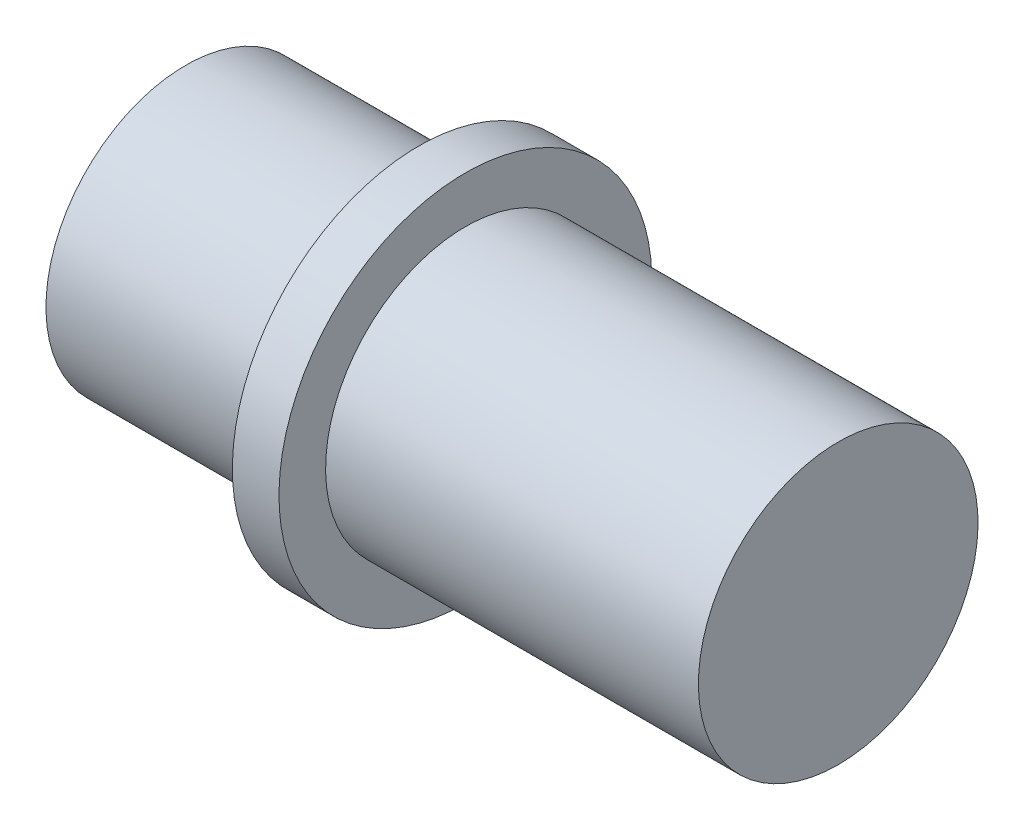
ISO-10303-21;
HEADER;
FILE_DESCRIPTION(('STEP AP214'),'2;1');
FILE_NAME('part.step','',(''),(''),'','','');
FILE_SCHEMA(('AUTOMOTIVE_DESIGN { 1 0 10303 214 1 1 1 1 }'));
ENDSEC;
DATA;
#1=APPLICATION_CONTEXT('core data for automotive mechanical design processes');
#2=APPLICATION_PROTOCOL_DEFINITION('international standard','automotive_design',2000,#1);
#3=PRODUCT_CONTEXT('',#1,'mechanical');
#4=PRODUCT('Part','Part','',(#3));
#5=PRODUCT_RELATED_PRODUCT_CATEGORY('part','',(#4));
#6=PRODUCT_DEFINITION_FORMATION('','',#4);
#7=PRODUCT_DEFINITION_CONTEXT('part definition',#1,'design');
#8=PRODUCT_DEFINITION('design','',#6,#7);
#9=PRODUCT_DEFINITION_SHAPE('','',#8);
#10=(LENGTH_UNIT() NAMED_UNIT(*) SI_UNIT(.MILLI.,.METRE.));
#11=(NAMED_UNIT(*) PLANE_ANGLE_UNIT() SI_UNIT($,.RADIAN.));
#12=(NAMED_UNIT(*) SI_UNIT($,.STERADIAN.) SOLID_ANGLE_UNIT());
#13=UNCERTAINTY_MEASURE_WITH_UNIT(LENGTH_MEASURE(1.E-05),#10,'distance_accuracy_value','');
#14=(GEOMETRIC_REPRESENTATION_CONTEXT(3) GLOBAL_UNCERTAINTY_ASSIGNED_CONTEXT((#13)) GLOBAL_UNIT_ASSIGNED_CONTEXT((#10,
#11,#12)) REPRESENTATION_CONTEXT('',''));
#15=CARTESIAN_POINT('',(0.,0.,0.));
#16=DIRECTION('',(0.,0.,1.));
#17=DIRECTION('',(1.,0.,0.));
#18=AXIS2_PLACEMENT_3D('',#15,#16,#17);
#19=CARTESIAN_POINT('',(0.,0.,0.));
#20=DIRECTION('',(1.,0.,0.));
#21=DIRECTION('',(0.,1.,0.));
#22=AXIS2_PLACEMENT_3D('',#19,#20,#21);
#23=PLANE('',#22);
#24=CARTESIAN_POINT('',(0.,0.,0.));
#25=DIRECTION('',(-1.,0.,0.));
#26=DIRECTION('',(0.,-1.,0.));
#27=AXIS2_PLACEMENT_3D('',#24,#25,#26);
#28=CIRCLE('',#27,3.);
#29=CARTESIAN_POINT('',(0.,-3.,0.));
#30=VERTEX_POINT('',#29);
#31=EDGE_CURVE('E11',#30,#30,#28,.T.);
#32=ORIENTED_EDGE('',*,*,#31,.T.);
#33=EDGE_LOOP('',(#32));
#34=FACE_BOUND('',#33,.T.);
#35=DIRECTION('',(0.,-0.5,-0.866025403784439));
#36=VECTOR('',#35,1.);
#37=CARTESIAN_POINT('',(0.,1.73205080756888,0.));
#38=LINE('',#37,#36);
#39=CARTESIAN_POINT('',(0.,1.73205080756888,0.));
#40=VERTEX_POINT('',#39);
#41=CARTESIAN_POINT('',(0.,0.866025403784439,-1.5));
#42=VERTEX_POINT('',#41);
#43=EDGE_CURVE('E147',#40,#42,#38,.T.);
#44=ORIENTED_EDGE('',*,*,#43,.F.);
#45=DIRECTION('',(0.,0.5,-0.866025403784439));
#46=VECTOR('',#45,1.);
#47=CARTESIAN_POINT('',(0.,0.86602540378444,1.5));
#48=LINE('',#47,#46);
#49=CARTESIAN_POINT('',(0.,0.86602540378444,1.5));
#50=VERTEX_POINT('',#49);
#51=EDGE_CURVE('E48',#50,#40,#48,.T.);
#52=ORIENTED_EDGE('',*,*,#51,.F.);
#53=DIRECTION('',(0.,1.,0.));
#54=VECTOR('',#53,1.);
#55=CARTESIAN_POINT('',(0.,-0.866025403784439,1.5));
#56=LINE('',#55,#54);
#57=CARTESIAN_POINT('',(0.,-0.866025403784439,1.5));
#58=VERTEX_POINT('',#57);
#59=EDGE_CURVE('E118',#58,#50,#56,.T.);
#60=ORIENTED_EDGE('',*,*,#59,.F.);
#61=DIRECTION('',(0.,0.5,0.866025403784439));
#62=VECTOR('',#61,1.);
#63=CARTESIAN_POINT('',(0.,-1.73205080756888,0.));
#64=LINE('',#63,#62);
#65=CARTESIAN_POINT('',(0.,-1.73205080756888,0.));
#66=VERTEX_POINT('',#65);
#67=EDGE_CURVE('E154',#66,#58,#64,.T.);
#68=ORIENTED_EDGE('',*,*,#67,.F.);
#69=DIRECTION('',(0.,-0.5,0.866025403784439));
#70=VECTOR('',#69,1.);
#71=CARTESIAN_POINT('',(0.,-0.866025403784439,-1.5));
#72=LINE('',#71,#70);
#73=CARTESIAN_POINT('',(0.,-0.866025403784439,-1.5));
#74=VERTEX_POINT('',#73);
#75=EDGE_CURVE('E151',#74,#66,#72,.T.);
#76=ORIENTED_EDGE('',*,*,#75,.F.);
#77=DIRECTION('',(0.,-1.,0.));
#78=VECTOR('',#77,1.);
#79=CARTESIAN_POINT('',(0.,0.866025403784439,-1.5));
#80=LINE('',#79,#78);
#81=EDGE_CURVE('E149',#42,#74,#80,.T.);
#82=ORIENTED_EDGE('',*,*,#81,.F.);
#83=EDGE_LOOP('',(#44,#52,#60,#68,#76,#82));
#84=FACE_BOUND('',#83,.T.);
#85=ADVANCED_FACE('F34',(#34,#84),#23,.F.);
#86=CARTESIAN_POINT('',(0.,0.,0.));
#87=DIRECTION('',(-1.,0.,0.));
#88=DIRECTION('',(0.,-1.,0.));
#89=AXIS2_PLACEMENT_3D('',#86,#87,#88);
#90=CYLINDRICAL_SURFACE('',#89,3.);
#91=ORIENTED_EDGE('',*,*,#31,.F.);
#92=EDGE_LOOP('',(#91));
#93=FACE_BOUND('',#92,.T.);
#94=CARTESIAN_POINT('',(5.,0.,0.));
#95=DIRECTION('',(-1.,0.,0.));
#96=DIRECTION('',(0.,-1.,0.));
#97=AXIS2_PLACEMENT_3D('',#94,#95,#96);
#98=CIRCLE('',#97,3.);
#99=CARTESIAN_POINT('',(5.,-3.,0.));
#100=VERTEX_POINT('',#99);
#101=EDGE_CURVE('E41',#100,#100,#98,.T.);
#102=ORIENTED_EDGE('',*,*,#101,.T.);
#103=EDGE_LOOP('',(#102));
#104=FACE_BOUND('',#103,.T.);
#105=ADVANCED_FACE('F188',(#93,#104),#90,.T.);
#106=CARTESIAN_POINT('',(5.,3.,0.));
#107=DIRECTION('',(1.,0.,0.));
#108=DIRECTION('',(0.,1.,0.));
#109=AXIS2_PLACEMENT_3D('',#106,#107,#108);
#110=PLANE('',#109);
#111=ORIENTED_EDGE('',*,*,#101,.F.);
#112=EDGE_LOOP('',(#111));
#113=FACE_BOUND('',#112,.T.);
#114=CARTESIAN_POINT('',(5.,0.,0.));
#115=DIRECTION('',(-1.,0.,0.));
#116=DIRECTION('',(0.,-1.,0.));
#117=AXIS2_PLACEMENT_3D('',#114,#115,#116);
#118=CIRCLE('',#117,4.);
#119=CARTESIAN_POINT('',(5.,-4.,0.));
#120=VERTEX_POINT('',#119);
#121=EDGE_CURVE('E183',#120,#120,#118,.T.);
#122=ORIENTED_EDGE('',*,*,#121,.T.);
#123=EDGE_LOOP('',(#122));
#124=FACE_BOUND('',#123,.T.);
#125=ADVANCED_FACE('F190',(#113,#124),#110,.F.);
#126=CARTESIAN_POINT('',(0.,0.,0.));
#127=DIRECTION('',(-1.,0.,0.));
#128=DIRECTION('',(0.,-1.,0.));
#129=AXIS2_PLACEMENT_3D('',#126,#127,#128);
#130=CYLINDRICAL_SURFACE('',#129,4.);
#131=ORIENTED_EDGE('',*,*,#121,.F.);
#132=EDGE_LOOP('',(#131));
#133=FACE_BOUND('',#132,.T.);
#134=CARTESIAN_POINT('',(6.,0.,0.));
#135=DIRECTION('',(-1.,0.,0.));
#136=DIRECTION('',(0.,-1.,0.));
#137=AXIS2_PLACEMENT_3D('',#134,#135,#136);
#138=CIRCLE('',#137,4.);
#139=CARTESIAN_POINT('',(6.,-4.,0.));
#140=VERTEX_POINT('',#139);
#141=EDGE_CURVE('E180',#140,#140,#138,.T.);
#142=ORIENTED_EDGE('',*,*,#141,.T.);
#143=EDGE_LOOP('',(#142));
#144=FACE_BOUND('',#143,.T.);
#145=ADVANCED_FACE('F193',(#133,#144),#130,.T.);
#146=CARTESIAN_POINT('',(6.,4.,0.));
#147=DIRECTION('',(-1.,0.,0.));
#148=DIRECTION('',(0.,-1.,0.));
#149=AXIS2_PLACEMENT_3D('',#146,#147,#148);
#150=PLANE('',#149);
#151=ORIENTED_EDGE('',*,*,#141,.F.);
#152=EDGE_LOOP('',(#151));
#153=FACE_BOUND('',#152,.T.);
#154=CARTESIAN_POINT('',(6.,0.,0.));
#155=DIRECTION('',(-1.,0.,0.));
#156=DIRECTION('',(0.,-1.,0.));
#157=AXIS2_PLACEMENT_3D('',#154,#155,#156);
#158=CIRCLE('',#157,3.);
#159=CARTESIAN_POINT('',(6.,-3.,0.));
#160=VERTEX_POINT('',#159);
#161=EDGE_CURVE('E177',#160,#160,#158,.T.);
#162=ORIENTED_EDGE('',*,*,#161,.T.);
#163=EDGE_LOOP('',(#162));
#164=FACE_BOUND('',#163,.T.);
#165=ADVANCED_FACE('F199',(#153,#164),#150,.F.);
#166=CARTESIAN_POINT('',(0.,0.,0.));
#167=DIRECTION('',(-1.,0.,0.));
#168=DIRECTION('',(0.,-1.,0.));
#169=AXIS2_PLACEMENT_3D('',#166,#167,#168);
#170=CYLINDRICAL_SURFACE('',#169,3.);
#171=ORIENTED_EDGE('',*,*,#161,.F.);
#172=EDGE_LOOP('',(#171));
#173=FACE_BOUND('',#172,.T.);
#174=CARTESIAN_POINT('',(14.,0.,0.));
#175=DIRECTION('',(-1.,0.,0.));
#176=DIRECTION('',(0.,-1.,0.));
#177=AXIS2_PLACEMENT_3D('',#174,#175,#176);
#178=CIRCLE('',#177,3.);
#179=CARTESIAN_POINT('',(14.,-3.,0.));
#180=VERTEX_POINT('',#179);
#181=EDGE_CURVE('E174',#180,#180,#178,.T.);
#182=ORIENTED_EDGE('',*,*,#181,.T.);
#183=EDGE_LOOP('',(#182));
#184=FACE_BOUND('',#183,.T.);
#185=ADVANCED_FACE('F205',(#173,#184),#170,.T.);
#186=CARTESIAN_POINT('',(14.,3.,0.));
#187=DIRECTION('',(-1.,0.,0.));
#188=DIRECTION('',(0.,-1.,0.));
#189=AXIS2_PLACEMENT_3D('',#186,#187,#188);
#190=PLANE('',#189);
#191=ORIENTED_EDGE('',*,*,#181,.F.);
#192=EDGE_LOOP('',(#191));
#193=FACE_BOUND('',#192,.T.);
#194=ADVANCED_FACE('F211',(#193),#190,.F.);
#195=CARTESIAN_POINT('',(1.8,0.86602540378444,1.5));
#196=DIRECTION('',(0.,0.866025403784439,0.5));
#197=DIRECTION('',(0.,-0.5,0.866025403784439));
#198=AXIS2_PLACEMENT_3D('',#195,#196,#197);
#199=PLANE('',#198);
#200=DIRECTION('',(0.,0.5,-0.866025403784439));
#201=VECTOR('',#200,1.);
#202=CARTESIAN_POINT('',(1.8,0.86602540378444,1.5));
#203=LINE('',#202,#201);
#204=CARTESIAN_POINT('',(1.8,0.86602540378444,1.5));
#205=VERTEX_POINT('',#204);
#206=CARTESIAN_POINT('',(1.8,1.29903810567666,0.75));
#207=VERTEX_POINT('',#206);
#208=EDGE_CURVE('E117',#205,#207,#203,.T.);
#209=ORIENTED_EDGE('',*,*,#208,.F.);
#210=DIRECTION('',(-1.,0.,0.));
#211=VECTOR('',#210,1.);
#212=CARTESIAN_POINT('',(1.8,0.86602540378444,1.5));
#213=LINE('',#212,#211);
#214=EDGE_CURVE('E157',#205,#50,#213,.T.);
#215=ORIENTED_EDGE('',*,*,#214,.T.);
#216=ORIENTED_EDGE('',*,*,#51,.T.);
#217=DIRECTION('',(-1.,0.,0.));
#218=VECTOR('',#217,1.);
#219=CARTESIAN_POINT('',(1.8,1.73205080756888,0.));
#220=LINE('',#219,#218);
#221=CARTESIAN_POINT('',(1.8,1.73205080756888,0.));
#222=VERTEX_POINT('',#221);
#223=EDGE_CURVE('E120',#222,#40,#220,.T.);
#224=ORIENTED_EDGE('',*,*,#223,.F.);
#225=EDGE_CURVE('E109',#207,#222,#203,.T.);
#226=ORIENTED_EDGE('',*,*,#225,.F.);
#227=EDGE_LOOP('',(#209,#215,#216,#224,#226));
#228=FACE_BOUND('',#227,.T.);
#229=ADVANCED_FACE('F121',(#228),#199,.F.);
#230=CARTESIAN_POINT('',(1.8,-0.866025403784439,1.5));
#231=DIRECTION('',(0.,0.,1.));
#232=DIRECTION('',(0.,-1.,0.));
#233=AXIS2_PLACEMENT_3D('',#230,#231,#232);
#234=PLANE('',#233);
#235=DIRECTION('',(0.,1.,0.));
#236=VECTOR('',#235,1.);
#237=CARTESIAN_POINT('',(1.8,-0.866025403784439,1.5));
#238=LINE('',#237,#236);
#239=CARTESIAN_POINT('',(1.8,-0.866025403784439,1.5));
#240=VERTEX_POINT('',#239);
#241=CARTESIAN_POINT('',(1.8,0.,1.5));
#242=VERTEX_POINT('',#241);
#243=EDGE_CURVE('E125',#240,#242,#238,.T.);
#244=ORIENTED_EDGE('',*,*,#243,.F.);
#245=DIRECTION('',(-1.,0.,0.));
#246=VECTOR('',#245,1.);
#247=CARTESIAN_POINT('',(1.8,-0.866025403784439,1.5));
#248=LINE('',#247,#246);
#249=EDGE_CURVE('E160',#240,#58,#248,.T.);
#250=ORIENTED_EDGE('',*,*,#249,.T.);
#251=ORIENTED_EDGE('',*,*,#59,.T.);
#252=ORIENTED_EDGE('',*,*,#214,.F.);
#253=EDGE_CURVE('E143',#242,#205,#238,.T.);
#254=ORIENTED_EDGE('',*,*,#253,.F.);
#255=EDGE_LOOP('',(#244,#250,#251,#252,#254));
#256=FACE_BOUND('',#255,.T.);
#257=ADVANCED_FACE('F220',(#256),#234,.F.);
#258=CARTESIAN_POINT('',(1.8,-1.73205080756888,0.));
#259=DIRECTION('',(0.,-0.866025403784439,0.5));
#260=DIRECTION('',(0.,-0.5,-0.866025403784439));
#261=AXIS2_PLACEMENT_3D('',#258,#259,#260);
#262=PLANE('',#261);
#263=DIRECTION('',(0.,0.5,0.866025403784439));
#264=VECTOR('',#263,1.);
#265=CARTESIAN_POINT('',(1.8,-1.73205080756888,0.));
#266=LINE('',#265,#264);
#267=CARTESIAN_POINT('',(1.8,-1.73205080756888,0.));
#268=VERTEX_POINT('',#267);
#269=CARTESIAN_POINT('',(1.8,-1.29903810567666,0.75));
#270=VERTEX_POINT('',#269);
#271=EDGE_CURVE('E56',#268,#270,#266,.T.);
#272=ORIENTED_EDGE('',*,*,#271,.F.);
#273=DIRECTION('',(-1.,0.,0.));
#274=VECTOR('',#273,1.);
#275=CARTESIAN_POINT('',(1.8,-1.73205080756888,0.));
#276=LINE('',#275,#274);
#277=EDGE_CURVE('E163',#268,#66,#276,.T.);
#278=ORIENTED_EDGE('',*,*,#277,.T.);
#279=ORIENTED_EDGE('',*,*,#67,.T.);
#280=ORIENTED_EDGE('',*,*,#249,.F.);
#281=EDGE_CURVE('E141',#270,#240,#266,.T.);
#282=ORIENTED_EDGE('',*,*,#281,.F.);
#283=EDGE_LOOP('',(#272,#278,#279,#280,#282));
#284=FACE_BOUND('',#283,.T.);
#285=ADVANCED_FACE('F273',(#284),#262,.F.);
#286=CARTESIAN_POINT('',(1.8,-0.866025403784439,-1.5));
#287=DIRECTION('',(0.,-0.866025403784439,-0.5));
#288=DIRECTION('',(0.,0.5,-0.866025403784439));
#289=AXIS2_PLACEMENT_3D('',#286,#287,#288);
#290=PLANE('',#289);
#291=DIRECTION('',(0.,-0.5,0.866025403784439));
#292=VECTOR('',#291,1.);
#293=CARTESIAN_POINT('',(1.8,-0.866025403784439,-1.5));
#294=LINE('',#293,#292);
#295=CARTESIAN_POINT('',(1.8,-0.866025403784439,-1.5));
#296=VERTEX_POINT('',#295);
#297=CARTESIAN_POINT('',(1.8,-1.29903810567666,-0.75));
#298=VERTEX_POINT('',#297);
#299=EDGE_CURVE('E138',#296,#298,#294,.T.);
#300=ORIENTED_EDGE('',*,*,#299,.F.);
#301=DIRECTION('',(-1.,0.,0.));
#302=VECTOR('',#301,1.);
#303=CARTESIAN_POINT('',(1.8,-0.866025403784439,-1.5));
#304=LINE('',#303,#302);
#305=EDGE_CURVE('E166',#296,#74,#304,.T.);
#306=ORIENTED_EDGE('',*,*,#305,.T.);
#307=ORIENTED_EDGE('',*,*,#75,.T.);
#308=ORIENTED_EDGE('',*,*,#277,.F.);
#309=EDGE_CURVE('E137',#298,#268,#294,.T.);
#310=ORIENTED_EDGE('',*,*,#309,.F.);
#311=EDGE_LOOP('',(#300,#306,#307,#308,#310));
#312=FACE_BOUND('',#311,.T.);
#313=ADVANCED_FACE('F276',(#312),#290,.F.);
#314=CARTESIAN_POINT('',(1.8,0.866025403784439,-1.5));
#315=DIRECTION('',(0.,0.,-1.));
#316=DIRECTION('',(0.,1.,0.));
#317=AXIS2_PLACEMENT_3D('',#314,#315,#316);
#318=PLANE('',#317);
#319=DIRECTION('',(0.,-1.,0.));
#320=VECTOR('',#319,1.);
#321=CARTESIAN_POINT('',(1.8,0.866025403784439,-1.5));
#322=LINE('',#321,#320);
#323=CARTESIAN_POINT('',(1.8,0.866025403784439,-1.5));
#324=VERTEX_POINT('',#323);
#325=CARTESIAN_POINT('',(1.8,0.,-1.5));
#326=VERTEX_POINT('',#325);
#327=EDGE_CURVE('E133',#324,#326,#322,.T.);
#328=ORIENTED_EDGE('',*,*,#327,.F.);
#329=DIRECTION('',(-1.,0.,0.));
#330=VECTOR('',#329,1.);
#331=CARTESIAN_POINT('',(1.8,0.866025403784439,-1.5));
#332=LINE('',#331,#330);
#333=EDGE_CURVE('E124',#324,#42,#332,.T.);
#334=ORIENTED_EDGE('',*,*,#333,.T.);
#335=ORIENTED_EDGE('',*,*,#81,.T.);
#336=ORIENTED_EDGE('',*,*,#305,.F.);
#337=EDGE_CURVE('E131',#326,#296,#322,.T.);
#338=ORIENTED_EDGE('',*,*,#337,.F.);
#339=EDGE_LOOP('',(#328,#334,#335,#336,#338));
#340=FACE_BOUND('',#339,.T.);
#341=ADVANCED_FACE('F236',(#340),#318,.F.);
#342=CARTESIAN_POINT('',(1.8,1.73205080756888,0.));
#343=DIRECTION('',(0.,0.866025403784438,-0.5));
#344=DIRECTION('',(0.,0.5,0.866025403784439));
#345=AXIS2_PLACEMENT_3D('',#342,#343,#344);
#346=PLANE('',#345);
#347=DIRECTION('',(0.,-0.5,-0.866025403784439));
#348=VECTOR('',#347,1.);
#349=CARTESIAN_POINT('',(1.8,1.73205080756888,0.));
#350=LINE('',#349,#348);
#351=CARTESIAN_POINT('',(1.8,1.29903810567666,-0.75));
#352=VERTEX_POINT('',#351);
#353=EDGE_CURVE('E112',#222,#352,#350,.T.);
#354=ORIENTED_EDGE('',*,*,#353,.F.);
#355=ORIENTED_EDGE('',*,*,#223,.T.);
#356=ORIENTED_EDGE('',*,*,#43,.T.);
#357=ORIENTED_EDGE('',*,*,#333,.F.);
#358=EDGE_CURVE('E130',#352,#324,#350,.T.);
#359=ORIENTED_EDGE('',*,*,#358,.F.);
#360=EDGE_LOOP('',(#354,#355,#356,#357,#359));
#361=FACE_BOUND('',#360,.T.);
#362=ADVANCED_FACE('F128',(#361),#346,.F.);
#363=CARTESIAN_POINT('',(1.8,0.,0.));
#364=DIRECTION('',(-1.,0.,0.));
#365=DIRECTION('',(0.,-1.,0.));
#366=AXIS2_PLACEMENT_3D('',#363,#364,#365);
#367=PLANE('',#366);
#368=ORIENTED_EDGE('',*,*,#281,.T.);
#369=ORIENTED_EDGE('',*,*,#243,.T.);
#370=CARTESIAN_POINT('',(1.8,0.,0.));
#371=DIRECTION('',(-1.,0.,0.));
#372=DIRECTION('',(0.,0.,1.));
#373=AXIS2_PLACEMENT_3D('',#370,#371,#372);
#374=CIRCLE('',#373,1.5);
#375=EDGE_CURVE('E159',#270,#242,#374,.T.);
#376=ORIENTED_EDGE('',*,*,#375,.F.);
#377=EDGE_LOOP('',(#368,#369,#376));
#378=FACE_BOUND('',#377,.T.);
#379=ADVANCED_FACE('F253',(#378),#367,.T.);
#380=ORIENTED_EDGE('',*,*,#253,.T.);
#381=ORIENTED_EDGE('',*,*,#208,.T.);
#382=EDGE_CURVE('E171',#242,#207,#374,.T.);
#383=ORIENTED_EDGE('',*,*,#382,.F.);
#384=EDGE_LOOP('',(#380,#381,#383));
#385=FACE_BOUND('',#384,.T.);
#386=ADVANCED_FACE('F260',(#385),#367,.T.);
#387=ORIENTED_EDGE('',*,*,#225,.T.);
#388=ORIENTED_EDGE('',*,*,#353,.T.);
#389=EDGE_CURVE('E114',#207,#352,#374,.T.);
#390=ORIENTED_EDGE('',*,*,#389,.F.);
#391=EDGE_LOOP('',(#387,#388,#390));
#392=FACE_BOUND('',#391,.T.);
#393=ADVANCED_FACE('F110',(#392),#367,.T.);
#394=ORIENTED_EDGE('',*,*,#358,.T.);
#395=ORIENTED_EDGE('',*,*,#327,.T.);
#396=EDGE_CURVE('E242',#352,#326,#374,.T.);
#397=ORIENTED_EDGE('',*,*,#396,.F.);
#398=EDGE_LOOP('',(#394,#395,#397));
#399=FACE_BOUND('',#398,.T.);
#400=ADVANCED_FACE('F241',(#399),#367,.T.);
#401=ORIENTED_EDGE('',*,*,#337,.T.);
#402=ORIENTED_EDGE('',*,*,#299,.T.);
#403=EDGE_CURVE('E248',#326,#298,#374,.T.);
#404=ORIENTED_EDGE('',*,*,#403,.F.);
#405=EDGE_LOOP('',(#401,#402,#404));
#406=FACE_BOUND('',#405,.T.);
#407=ADVANCED_FACE('F270',(#406),#367,.T.);
#408=ORIENTED_EDGE('',*,*,#309,.T.);
#409=ORIENTED_EDGE('',*,*,#271,.T.);
#410=EDGE_CURVE('E249',#298,#270,#374,.T.);
#411=ORIENTED_EDGE('',*,*,#410,.F.);
#412=EDGE_LOOP('',(#408,#409,#411));
#413=FACE_BOUND('',#412,.T.);
#414=ADVANCED_FACE('F267',(#413),#367,.T.);
#415=CARTESIAN_POINT('',(2.66602540378445,0.,0.));
#416=DIRECTION('',(-1.,0.,0.));
#417=DIRECTION('',(0.,0.,1.));
#418=AXIS2_PLACEMENT_3D('',#415,#416,#417);
#419=CONICAL_SURFACE('',#418,0.,1.04719755119659);
#420=ORIENTED_EDGE('',*,*,#382,.T.);
#421=ORIENTED_EDGE('',*,*,#389,.T.);
#422=ORIENTED_EDGE('',*,*,#396,.T.);
#423=ORIENTED_EDGE('',*,*,#403,.T.);
#424=ORIENTED_EDGE('',*,*,#410,.T.);
#425=ORIENTED_EDGE('',*,*,#375,.T.);
#426=EDGE_LOOP('',(#420,#421,#422,#423,#424,#425));
#427=FACE_BOUND('',#426,.T.);
#428=CARTESIAN_POINT('',(2.66602540378445,0.,0.));
#429=VERTEX_POINT('',#428);
#430=VERTEX_LOOP('',#429);
#431=FACE_BOUND('',#430,.T.);
#432=ADVANCED_FACE('F245',(#427,#431),#419,.F.);
#433=CLOSED_SHELL('',(#85,#105,#125,#145,#165,#185,#194,#229,#257,#285,#313,#341,#362,#379,#386,
#393,#400,#407,#414,#432));
#434=MANIFOLD_SOLID_BREP('B2',#433);
#435=ADVANCED_BREP_SHAPE_REPRESENTATION('',(#18,#434),#14);
#436=SHAPE_DEFINITION_REPRESENTATION(#9,#435);
ENDSEC;
END-ISO-10303-21;
